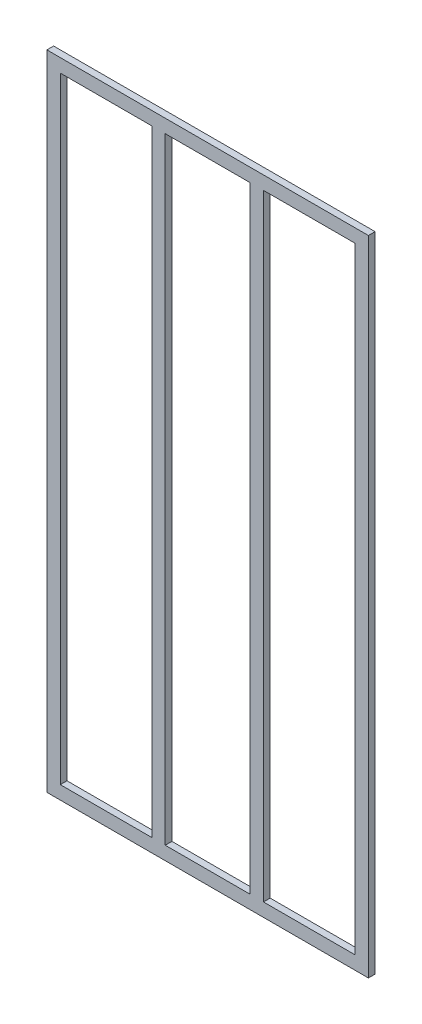
ISO-10303-21;
HEADER;
FILE_DESCRIPTION(('STEP AP214'),'2;1');
FILE_NAME('part.step','',(''),(''),'','','');
FILE_SCHEMA(('AUTOMOTIVE_DESIGN { 1 0 10303 214 1 1 1 1 }'));
ENDSEC;
DATA;
#1=APPLICATION_CONTEXT('core data for automotive mechanical design processes');
#2=APPLICATION_PROTOCOL_DEFINITION('international standard','automotive_design',2000,#1);
#3=PRODUCT_CONTEXT('',#1,'mechanical');
#4=PRODUCT('Part','Part','',(#3));
#5=PRODUCT_RELATED_PRODUCT_CATEGORY('part','',(#4));
#6=PRODUCT_DEFINITION_FORMATION('','',#4);
#7=PRODUCT_DEFINITION_CONTEXT('part definition',#1,'design');
#8=PRODUCT_DEFINITION('design','',#6,#7);
#9=PRODUCT_DEFINITION_SHAPE('','',#8);
#10=(LENGTH_UNIT() NAMED_UNIT(*) SI_UNIT(.MILLI.,.METRE.));
#11=(NAMED_UNIT(*) PLANE_ANGLE_UNIT() SI_UNIT($,.RADIAN.));
#12=(NAMED_UNIT(*) SI_UNIT($,.STERADIAN.) SOLID_ANGLE_UNIT());
#13=UNCERTAINTY_MEASURE_WITH_UNIT(LENGTH_MEASURE(1.E-05),#10,'distance_accuracy_value','');
#14=(GEOMETRIC_REPRESENTATION_CONTEXT(3) GLOBAL_UNCERTAINTY_ASSIGNED_CONTEXT((#13)) GLOBAL_UNIT_ASSIGNED_CONTEXT((#10,
#11,#12)) REPRESENTATION_CONTEXT('',''));
#15=CARTESIAN_POINT('',(0.,0.,0.));
#16=DIRECTION('',(0.,0.,1.));
#17=DIRECTION('',(1.,0.,0.));
#18=AXIS2_PLACEMENT_3D('',#15,#16,#17);
#19=CARTESIAN_POINT('',(-559.2,-1169.2,25.4));
#20=DIRECTION('',(0.,1.,0.));
#21=DIRECTION('',(0.,0.,1.));
#22=AXIS2_PLACEMENT_3D('',#19,#20,#21);
#23=PLANE('',#22);
#24=DIRECTION('',(0.,0.,1.));
#25=VECTOR('',#24,1.);
#26=CARTESIAN_POINT('',(161.,-1169.2,0.));
#27=LINE('',#26,#25);
#28=CARTESIAN_POINT('',(161.,-1169.2,0.));
#29=VERTEX_POINT('',#28);
#30=CARTESIAN_POINT('',(161.,-1169.2,25.4));
#31=VERTEX_POINT('',#30);
#32=EDGE_CURVE('E148',#29,#31,#27,.T.);
#33=ORIENTED_EDGE('',*,*,#32,.F.);
#34=DIRECTION('',(1.,0.,0.));
#35=VECTOR('',#34,1.);
#36=CARTESIAN_POINT('',(-559.2,-1169.2,0.));
#37=LINE('',#36,#35);
#38=CARTESIAN_POINT('',(-161.,-1169.2,0.));
#39=VERTEX_POINT('',#38);
#40=EDGE_CURVE('E158',#39,#29,#37,.T.);
#41=ORIENTED_EDGE('',*,*,#40,.F.);
#42=DIRECTION('',(0.,0.,1.));
#43=VECTOR('',#42,1.);
#44=CARTESIAN_POINT('',(-161.,-1169.2,0.));
#45=LINE('',#44,#43);
#46=CARTESIAN_POINT('',(-161.,-1169.2,25.4));
#47=VERTEX_POINT('',#46);
#48=EDGE_CURVE('E172',#39,#47,#45,.T.);
#49=ORIENTED_EDGE('',*,*,#48,.T.);
#50=DIRECTION('',(1.,0.,0.));
#51=VECTOR('',#50,1.);
#52=CARTESIAN_POINT('',(-559.2,-1169.2,25.4));
#53=LINE('',#52,#51);
#54=EDGE_CURVE('E160',#47,#31,#53,.T.);
#55=ORIENTED_EDGE('',*,*,#54,.T.);
#56=EDGE_LOOP('',(#33,#41,#49,#55));
#57=FACE_BOUND('',#56,.T.);
#58=ADVANCED_FACE('F35',(#57),#23,.T.);
#59=CARTESIAN_POINT('',(-559.2,1169.2,25.4));
#60=DIRECTION('',(0.,-1.,0.));
#61=DIRECTION('',(1.,0.,0.));
#62=AXIS2_PLACEMENT_3D('',#59,#60,#61);
#63=PLANE('',#62);
#64=DIRECTION('',(0.,0.,1.));
#65=VECTOR('',#64,1.);
#66=CARTESIAN_POINT('',(161.,1169.2,0.));
#67=LINE('',#66,#65);
#68=CARTESIAN_POINT('',(160.999999999999,1169.2,0.));
#69=VERTEX_POINT('',#68);
#70=CARTESIAN_POINT('',(161.,1169.2,25.4));
#71=VERTEX_POINT('',#70);
#72=EDGE_CURVE('E151',#69,#71,#67,.T.);
#73=ORIENTED_EDGE('',*,*,#72,.T.);
#74=DIRECTION('',(-1.,0.,0.));
#75=VECTOR('',#74,1.);
#76=CARTESIAN_POINT('',(-559.2,1169.2,25.4));
#77=LINE('',#76,#75);
#78=CARTESIAN_POINT('',(-161.,1169.2,25.4));
#79=VERTEX_POINT('',#78);
#80=EDGE_CURVE('E310',#71,#79,#77,.T.);
#81=ORIENTED_EDGE('',*,*,#80,.T.);
#82=DIRECTION('',(0.,0.,1.));
#83=VECTOR('',#82,1.);
#84=CARTESIAN_POINT('',(-161.,1169.2,0.));
#85=LINE('',#84,#83);
#86=CARTESIAN_POINT('',(-161.,1169.2,0.));
#87=VERTEX_POINT('',#86);
#88=EDGE_CURVE('E292',#87,#79,#85,.T.);
#89=ORIENTED_EDGE('',*,*,#88,.F.);
#90=DIRECTION('',(-1.,0.,0.));
#91=VECTOR('',#90,1.);
#92=CARTESIAN_POINT('',(-559.2,1169.2,0.));
#93=LINE('',#92,#91);
#94=EDGE_CURVE('E183',#69,#87,#93,.T.);
#95=ORIENTED_EDGE('',*,*,#94,.F.);
#96=EDGE_LOOP('',(#73,#81,#89,#95));
#97=FACE_BOUND('',#96,.T.);
#98=ADVANCED_FACE('F251',(#97),#63,.T.);
#99=DIRECTION('',(0.,0.,1.));
#100=VECTOR('',#99,1.);
#101=CARTESIAN_POINT('',(211.8,-1169.2,0.));
#102=LINE('',#101,#100);
#103=CARTESIAN_POINT('',(211.799999999999,-1169.2,0.));
#104=VERTEX_POINT('',#103);
#105=CARTESIAN_POINT('',(211.8,-1169.2,25.4));
#106=VERTEX_POINT('',#105);
#107=EDGE_CURVE('E161',#104,#106,#102,.T.);
#108=ORIENTED_EDGE('',*,*,#107,.T.);
#109=CARTESIAN_POINT('',(559.2,-1169.2,25.4));
#110=VERTEX_POINT('',#109);
#111=EDGE_CURVE('E186',#106,#110,#53,.T.);
#112=ORIENTED_EDGE('',*,*,#111,.T.);
#113=DIRECTION('',(0.,0.,-1.));
#114=VECTOR('',#113,1.);
#115=CARTESIAN_POINT('',(559.2,-1169.2,25.4));
#116=LINE('',#115,#114);
#117=CARTESIAN_POINT('',(559.2,-1169.2,0.));
#118=VERTEX_POINT('',#117);
#119=EDGE_CURVE('E195',#110,#118,#116,.T.);
#120=ORIENTED_EDGE('',*,*,#119,.T.);
#121=EDGE_CURVE('E168',#104,#118,#37,.T.);
#122=ORIENTED_EDGE('',*,*,#121,.F.);
#123=EDGE_LOOP('',(#108,#112,#120,#122));
#124=FACE_BOUND('',#123,.T.);
#125=ADVANCED_FACE('F253',(#124),#23,.T.);
#126=DIRECTION('',(0.,0.,1.));
#127=VECTOR('',#126,1.);
#128=CARTESIAN_POINT('',(211.8,1169.2,0.));
#129=LINE('',#128,#127);
#130=CARTESIAN_POINT('',(211.8,1169.2,0.));
#131=VERTEX_POINT('',#130);
#132=CARTESIAN_POINT('',(211.8,1169.2,25.4));
#133=VERTEX_POINT('',#132);
#134=EDGE_CURVE('E340',#131,#133,#129,.T.);
#135=ORIENTED_EDGE('',*,*,#134,.F.);
#136=CARTESIAN_POINT('',(559.2,1169.2,0.));
#137=VERTEX_POINT('',#136);
#138=EDGE_CURVE('E180',#137,#131,#93,.T.);
#139=ORIENTED_EDGE('',*,*,#138,.F.);
#140=DIRECTION('',(0.,0.,-1.));
#141=VECTOR('',#140,1.);
#142=CARTESIAN_POINT('',(559.2,1169.2,25.4));
#143=LINE('',#142,#141);
#144=CARTESIAN_POINT('',(559.2,1169.2,25.4));
#145=VERTEX_POINT('',#144);
#146=EDGE_CURVE('E193',#145,#137,#143,.T.);
#147=ORIENTED_EDGE('',*,*,#146,.F.);
#148=EDGE_CURVE('E308',#145,#133,#77,.T.);
#149=ORIENTED_EDGE('',*,*,#148,.T.);
#150=EDGE_LOOP('',(#135,#139,#147,#149));
#151=FACE_BOUND('',#150,.T.);
#152=ADVANCED_FACE('F260',(#151),#63,.T.);
#153=CARTESIAN_POINT('',(0.,0.,25.4));
#154=DIRECTION('',(0.,0.,-1.));
#155=DIRECTION('',(-1.,0.,0.));
#156=AXIS2_PLACEMENT_3D('',#153,#154,#155);
#157=PLANE('',#156);
#158=ORIENTED_EDGE('',*,*,#80,.F.);
#159=DIRECTION('',(0.,-1.,0.));
#160=VECTOR('',#159,1.);
#161=CARTESIAN_POINT('',(161.,-1169.2,25.4));
#162=LINE('',#161,#160);
#163=EDGE_CURVE('E334',#71,#31,#162,.T.);
#164=ORIENTED_EDGE('',*,*,#163,.T.);
#165=ORIENTED_EDGE('',*,*,#54,.F.);
#166=DIRECTION('',(0.,1.,0.));
#167=VECTOR('',#166,1.);
#168=CARTESIAN_POINT('',(-161.,-1169.2,25.4));
#169=LINE('',#168,#167);
#170=EDGE_CURVE('E299',#47,#79,#169,.T.);
#171=ORIENTED_EDGE('',*,*,#170,.T.);
#172=EDGE_LOOP('',(#158,#164,#165,#171));
#173=FACE_BOUND('',#172,.T.);
#174=DIRECTION('',(0.,1.,0.));
#175=VECTOR('',#174,1.);
#176=CARTESIAN_POINT('',(211.8,-1169.2,25.4));
#177=LINE('',#176,#175);
#178=EDGE_CURVE('E153',#106,#133,#177,.T.);
#179=ORIENTED_EDGE('',*,*,#178,.T.);
#180=ORIENTED_EDGE('',*,*,#148,.F.);
#181=DIRECTION('',(0.,1.,0.));
#182=VECTOR('',#181,1.);
#183=CARTESIAN_POINT('',(559.2,-1169.2,25.4));
#184=LINE('',#183,#182);
#185=EDGE_CURVE('E306',#110,#145,#184,.T.);
#186=ORIENTED_EDGE('',*,*,#185,.F.);
#187=ORIENTED_EDGE('',*,*,#111,.F.);
#188=EDGE_LOOP('',(#179,#180,#186,#187));
#189=FACE_BOUND('',#188,.T.);
#190=DIRECTION('',(0.,1.,0.));
#191=VECTOR('',#190,1.);
#192=CARTESIAN_POINT('',(610.,-1220.,25.4));
#193=LINE('',#192,#191);
#194=CARTESIAN_POINT('',(610.,-1220.,25.4));
#195=VERTEX_POINT('',#194);
#196=CARTESIAN_POINT('',(610.,1220.,25.4));
#197=VERTEX_POINT('',#196);
#198=EDGE_CURVE('E199',#195,#197,#193,.T.);
#199=ORIENTED_EDGE('',*,*,#198,.T.);
#200=DIRECTION('',(-1.,0.,0.));
#201=VECTOR('',#200,1.);
#202=CARTESIAN_POINT('',(-610.,1220.,25.4));
#203=LINE('',#202,#201);
#204=CARTESIAN_POINT('',(-610.,1220.,25.4));
#205=VERTEX_POINT('',#204);
#206=EDGE_CURVE('E202',#197,#205,#203,.T.);
#207=ORIENTED_EDGE('',*,*,#206,.T.);
#208=DIRECTION('',(0.,-1.,0.));
#209=VECTOR('',#208,1.);
#210=CARTESIAN_POINT('',(-610.,-1220.,25.4));
#211=LINE('',#210,#209);
#212=CARTESIAN_POINT('',(-610.,-1220.,25.4));
#213=VERTEX_POINT('',#212);
#214=EDGE_CURVE('E205',#205,#213,#211,.T.);
#215=ORIENTED_EDGE('',*,*,#214,.T.);
#216=DIRECTION('',(1.,0.,0.));
#217=VECTOR('',#216,1.);
#218=CARTESIAN_POINT('',(-610.,-1220.,25.4));
#219=LINE('',#218,#217);
#220=EDGE_CURVE('E207',#213,#195,#219,.T.);
#221=ORIENTED_EDGE('',*,*,#220,.T.);
#222=EDGE_LOOP('',(#199,#207,#215,#221));
#223=FACE_BOUND('',#222,.T.);
#224=CARTESIAN_POINT('',(-559.2,-1169.2,25.4));
#225=VERTEX_POINT('',#224);
#226=CARTESIAN_POINT('',(-211.8,-1169.2,25.4));
#227=VERTEX_POINT('',#226);
#228=EDGE_CURVE('E279',#225,#227,#53,.T.);
#229=ORIENTED_EDGE('',*,*,#228,.F.);
#230=DIRECTION('',(0.,-1.,0.));
#231=VECTOR('',#230,1.);
#232=CARTESIAN_POINT('',(-559.2,-1169.2,25.4));
#233=LINE('',#232,#231);
#234=CARTESIAN_POINT('',(-559.2,1169.2,25.4));
#235=VERTEX_POINT('',#234);
#236=EDGE_CURVE('E175',#235,#225,#233,.T.);
#237=ORIENTED_EDGE('',*,*,#236,.F.);
#238=CARTESIAN_POINT('',(-211.8,1169.2,25.4));
#239=VERTEX_POINT('',#238);
#240=EDGE_CURVE('E307',#239,#235,#77,.T.);
#241=ORIENTED_EDGE('',*,*,#240,.F.);
#242=DIRECTION('',(0.,-1.,0.));
#243=VECTOR('',#242,1.);
#244=CARTESIAN_POINT('',(-211.8,-1169.2,25.4));
#245=LINE('',#244,#243);
#246=EDGE_CURVE('E296',#239,#227,#245,.T.);
#247=ORIENTED_EDGE('',*,*,#246,.T.);
#248=EDGE_LOOP('',(#229,#237,#241,#247));
#249=FACE_BOUND('',#248,.T.);
#250=ADVANCED_FACE('F241',(#173,#189,#223,#249),#157,.F.);
#251=CARTESIAN_POINT('',(0.,0.,0.));
#252=DIRECTION('',(0.,0.,-1.));
#253=DIRECTION('',(-1.,0.,0.));
#254=AXIS2_PLACEMENT_3D('',#251,#252,#253);
#255=PLANE('',#254);
#256=DIRECTION('',(0.,-1.,0.));
#257=VECTOR('',#256,1.);
#258=CARTESIAN_POINT('',(161.,-1169.2,0.));
#259=LINE('',#258,#257);
#260=EDGE_CURVE('E50',#69,#29,#259,.T.);
#261=ORIENTED_EDGE('',*,*,#260,.F.);
#262=ORIENTED_EDGE('',*,*,#94,.T.);
#263=DIRECTION('',(0.,1.,0.));
#264=VECTOR('',#263,1.);
#265=CARTESIAN_POINT('',(-161.,-1169.2,0.));
#266=LINE('',#265,#264);
#267=EDGE_CURVE('E166',#39,#87,#266,.T.);
#268=ORIENTED_EDGE('',*,*,#267,.F.);
#269=ORIENTED_EDGE('',*,*,#40,.T.);
#270=EDGE_LOOP('',(#261,#262,#268,#269));
#271=FACE_BOUND('',#270,.T.);
#272=ORIENTED_EDGE('',*,*,#138,.T.);
#273=DIRECTION('',(0.,1.,0.));
#274=VECTOR('',#273,1.);
#275=CARTESIAN_POINT('',(211.8,-1169.2,0.));
#276=LINE('',#275,#274);
#277=EDGE_CURVE('E58',#104,#131,#276,.T.);
#278=ORIENTED_EDGE('',*,*,#277,.F.);
#279=ORIENTED_EDGE('',*,*,#121,.T.);
#280=DIRECTION('',(0.,1.,0.));
#281=VECTOR('',#280,1.);
#282=CARTESIAN_POINT('',(559.2,-1169.2,0.));
#283=LINE('',#282,#281);
#284=EDGE_CURVE('E171',#118,#137,#283,.T.);
#285=ORIENTED_EDGE('',*,*,#284,.T.);
#286=EDGE_LOOP('',(#272,#278,#279,#285));
#287=FACE_BOUND('',#286,.T.);
#288=DIRECTION('',(0.,1.,0.));
#289=VECTOR('',#288,1.);
#290=CARTESIAN_POINT('',(610.,-1220.,0.));
#291=LINE('',#290,#289);
#292=CARTESIAN_POINT('',(610.,-1220.,0.));
#293=VERTEX_POINT('',#292);
#294=CARTESIAN_POINT('',(610.,1220.,0.));
#295=VERTEX_POINT('',#294);
#296=EDGE_CURVE('E198',#293,#295,#291,.T.);
#297=ORIENTED_EDGE('',*,*,#296,.F.);
#298=DIRECTION('',(1.,0.,0.));
#299=VECTOR('',#298,1.);
#300=CARTESIAN_POINT('',(-610.,-1220.,0.));
#301=LINE('',#300,#299);
#302=CARTESIAN_POINT('',(-610.,-1220.,0.));
#303=VERTEX_POINT('',#302);
#304=EDGE_CURVE('E203',#303,#293,#301,.T.);
#305=ORIENTED_EDGE('',*,*,#304,.F.);
#306=DIRECTION('',(0.,-1.,0.));
#307=VECTOR('',#306,1.);
#308=CARTESIAN_POINT('',(-610.,-1220.,0.));
#309=LINE('',#308,#307);
#310=CARTESIAN_POINT('',(-610.,1220.,0.));
#311=VERTEX_POINT('',#310);
#312=EDGE_CURVE('E214',#311,#303,#309,.T.);
#313=ORIENTED_EDGE('',*,*,#312,.F.);
#314=DIRECTION('',(-1.,0.,0.));
#315=VECTOR('',#314,1.);
#316=CARTESIAN_POINT('',(-610.,1220.,0.));
#317=LINE('',#316,#315);
#318=EDGE_CURVE('E212',#295,#311,#317,.T.);
#319=ORIENTED_EDGE('',*,*,#318,.F.);
#320=EDGE_LOOP('',(#297,#305,#313,#319));
#321=FACE_BOUND('',#320,.T.);
#322=DIRECTION('',(0.,-1.,0.));
#323=VECTOR('',#322,1.);
#324=CARTESIAN_POINT('',(-559.2,-1169.2,0.));
#325=LINE('',#324,#323);
#326=CARTESIAN_POINT('',(-559.2,1169.2,0.));
#327=VERTEX_POINT('',#326);
#328=CARTESIAN_POINT('',(-559.2,-1169.2,0.));
#329=VERTEX_POINT('',#328);
#330=EDGE_CURVE('E182',#327,#329,#325,.T.);
#331=ORIENTED_EDGE('',*,*,#330,.T.);
#332=CARTESIAN_POINT('',(-211.8,-1169.2,0.));
#333=VERTEX_POINT('',#332);
#334=EDGE_CURVE('E167',#329,#333,#37,.T.);
#335=ORIENTED_EDGE('',*,*,#334,.T.);
#336=DIRECTION('',(0.,-1.,0.));
#337=VECTOR('',#336,1.);
#338=CARTESIAN_POINT('',(-211.8,-1169.2,0.));
#339=LINE('',#338,#337);
#340=CARTESIAN_POINT('',(-211.8,1169.2,0.));
#341=VERTEX_POINT('',#340);
#342=EDGE_CURVE('E287',#341,#333,#339,.T.);
#343=ORIENTED_EDGE('',*,*,#342,.F.);
#344=EDGE_CURVE('E179',#341,#327,#93,.T.);
#345=ORIENTED_EDGE('',*,*,#344,.T.);
#346=EDGE_LOOP('',(#331,#335,#343,#345));
#347=FACE_BOUND('',#346,.T.);
#348=ADVANCED_FACE('F164',(#271,#287,#321,#347),#255,.T.);
#349=CARTESIAN_POINT('',(610.,-1220.,25.4));
#350=DIRECTION('',(-1.,0.,0.));
#351=DIRECTION('',(0.,0.,1.));
#352=AXIS2_PLACEMENT_3D('',#349,#350,#351);
#353=PLANE('',#352);
#354=ORIENTED_EDGE('',*,*,#296,.T.);
#355=DIRECTION('',(0.,0.,-1.));
#356=VECTOR('',#355,1.);
#357=CARTESIAN_POINT('',(610.,1220.,25.4));
#358=LINE('',#357,#356);
#359=EDGE_CURVE('E11',#197,#295,#358,.T.);
#360=ORIENTED_EDGE('',*,*,#359,.F.);
#361=ORIENTED_EDGE('',*,*,#198,.F.);
#362=DIRECTION('',(0.,0.,-1.));
#363=VECTOR('',#362,1.);
#364=CARTESIAN_POINT('',(610.,-1220.,25.4));
#365=LINE('',#364,#363);
#366=EDGE_CURVE('E209',#195,#293,#365,.T.);
#367=ORIENTED_EDGE('',*,*,#366,.T.);
#368=EDGE_LOOP('',(#354,#360,#361,#367));
#369=FACE_BOUND('',#368,.T.);
#370=ADVANCED_FACE('F37',(#369),#353,.F.);
#371=CARTESIAN_POINT('',(-610.,1220.,25.4));
#372=DIRECTION('',(0.,-1.,0.));
#373=DIRECTION('',(0.,0.,-1.));
#374=AXIS2_PLACEMENT_3D('',#371,#372,#373);
#375=PLANE('',#374);
#376=ORIENTED_EDGE('',*,*,#318,.T.);
#377=DIRECTION('',(0.,0.,-1.));
#378=VECTOR('',#377,1.);
#379=CARTESIAN_POINT('',(-610.,1220.,25.4));
#380=LINE('',#379,#378);
#381=EDGE_CURVE('E43',#205,#311,#380,.T.);
#382=ORIENTED_EDGE('',*,*,#381,.F.);
#383=ORIENTED_EDGE('',*,*,#206,.F.);
#384=ORIENTED_EDGE('',*,*,#359,.T.);
#385=EDGE_LOOP('',(#376,#382,#383,#384));
#386=FACE_BOUND('',#385,.T.);
#387=ADVANCED_FACE('F243',(#386),#375,.F.);
#388=CARTESIAN_POINT('',(-610.,-1220.,25.4));
#389=DIRECTION('',(1.,0.,0.));
#390=DIRECTION('',(0.,0.,-1.));
#391=AXIS2_PLACEMENT_3D('',#388,#389,#390);
#392=PLANE('',#391);
#393=ORIENTED_EDGE('',*,*,#312,.T.);
#394=DIRECTION('',(0.,0.,-1.));
#395=VECTOR('',#394,1.);
#396=CARTESIAN_POINT('',(-610.,-1220.,25.4));
#397=LINE('',#396,#395);
#398=EDGE_CURVE('E219',#213,#303,#397,.T.);
#399=ORIENTED_EDGE('',*,*,#398,.F.);
#400=ORIENTED_EDGE('',*,*,#214,.F.);
#401=ORIENTED_EDGE('',*,*,#381,.T.);
#402=EDGE_LOOP('',(#393,#399,#400,#401));
#403=FACE_BOUND('',#402,.T.);
#404=ADVANCED_FACE('F226',(#403),#392,.F.);
#405=CARTESIAN_POINT('',(-610.,-1220.,25.4));
#406=DIRECTION('',(0.,1.,0.));
#407=DIRECTION('',(0.,0.,1.));
#408=AXIS2_PLACEMENT_3D('',#405,#406,#407);
#409=PLANE('',#408);
#410=ORIENTED_EDGE('',*,*,#304,.T.);
#411=ORIENTED_EDGE('',*,*,#366,.F.);
#412=ORIENTED_EDGE('',*,*,#220,.F.);
#413=ORIENTED_EDGE('',*,*,#398,.T.);
#414=EDGE_LOOP('',(#410,#411,#412,#413));
#415=FACE_BOUND('',#414,.T.);
#416=ADVANCED_FACE('F235',(#415),#409,.F.);
#417=DIRECTION('',(0.,0.,1.));
#418=VECTOR('',#417,1.);
#419=CARTESIAN_POINT('',(-211.8,-1169.2,0.));
#420=LINE('',#419,#418);
#421=EDGE_CURVE('E276',#333,#227,#420,.T.);
#422=ORIENTED_EDGE('',*,*,#421,.F.);
#423=ORIENTED_EDGE('',*,*,#334,.F.);
#424=DIRECTION('',(0.,0.,-1.));
#425=VECTOR('',#424,1.);
#426=CARTESIAN_POINT('',(-559.2,-1169.2,25.4));
#427=LINE('',#426,#425);
#428=EDGE_CURVE('E187',#225,#329,#427,.T.);
#429=ORIENTED_EDGE('',*,*,#428,.F.);
#430=ORIENTED_EDGE('',*,*,#228,.T.);
#431=EDGE_LOOP('',(#422,#423,#429,#430));
#432=FACE_BOUND('',#431,.T.);
#433=ADVANCED_FACE('F254',(#432),#23,.T.);
#434=CARTESIAN_POINT('',(559.2,-1169.2,25.4));
#435=DIRECTION('',(-1.,0.,0.));
#436=DIRECTION('',(0.,0.,1.));
#437=AXIS2_PLACEMENT_3D('',#434,#435,#436);
#438=PLANE('',#437);
#439=ORIENTED_EDGE('',*,*,#284,.F.);
#440=ORIENTED_EDGE('',*,*,#119,.F.);
#441=ORIENTED_EDGE('',*,*,#185,.T.);
#442=ORIENTED_EDGE('',*,*,#146,.T.);
#443=EDGE_LOOP('',(#439,#440,#441,#442));
#444=FACE_BOUND('',#443,.T.);
#445=ADVANCED_FACE('F267',(#444),#438,.T.);
#446=DIRECTION('',(0.,0.,1.));
#447=VECTOR('',#446,1.);
#448=CARTESIAN_POINT('',(-211.8,1169.2,0.));
#449=LINE('',#448,#447);
#450=EDGE_CURVE('E284',#341,#239,#449,.T.);
#451=ORIENTED_EDGE('',*,*,#450,.T.);
#452=ORIENTED_EDGE('',*,*,#240,.T.);
#453=DIRECTION('',(0.,0.,-1.));
#454=VECTOR('',#453,1.);
#455=CARTESIAN_POINT('',(-559.2,1169.2,25.4));
#456=LINE('',#455,#454);
#457=EDGE_CURVE('E190',#235,#327,#456,.T.);
#458=ORIENTED_EDGE('',*,*,#457,.T.);
#459=ORIENTED_EDGE('',*,*,#344,.F.);
#460=EDGE_LOOP('',(#451,#452,#458,#459));
#461=FACE_BOUND('',#460,.T.);
#462=ADVANCED_FACE('F261',(#461),#63,.T.);
#463=CARTESIAN_POINT('',(-559.2,-1169.2,25.4));
#464=DIRECTION('',(1.,0.,0.));
#465=DIRECTION('',(0.,0.,-1.));
#466=AXIS2_PLACEMENT_3D('',#463,#464,#465);
#467=PLANE('',#466);
#468=ORIENTED_EDGE('',*,*,#330,.F.);
#469=ORIENTED_EDGE('',*,*,#457,.F.);
#470=ORIENTED_EDGE('',*,*,#236,.T.);
#471=ORIENTED_EDGE('',*,*,#428,.T.);
#472=EDGE_LOOP('',(#468,#469,#470,#471));
#473=FACE_BOUND('',#472,.T.);
#474=ADVANCED_FACE('F319',(#473),#467,.T.);
#475=CARTESIAN_POINT('',(-161.,-1169.2,0.));
#476=DIRECTION('',(1.,0.,0.));
#477=DIRECTION('',(0.,0.,-1.));
#478=AXIS2_PLACEMENT_3D('',#475,#476,#477);
#479=PLANE('',#478);
#480=ORIENTED_EDGE('',*,*,#170,.F.);
#481=ORIENTED_EDGE('',*,*,#48,.F.);
#482=ORIENTED_EDGE('',*,*,#267,.T.);
#483=ORIENTED_EDGE('',*,*,#88,.T.);
#484=EDGE_LOOP('',(#480,#481,#482,#483));
#485=FACE_BOUND('',#484,.T.);
#486=ADVANCED_FACE('F356',(#485),#479,.T.);
#487=CARTESIAN_POINT('',(-211.8,-1169.2,0.));
#488=DIRECTION('',(-1.,0.,0.));
#489=DIRECTION('',(0.,0.,1.));
#490=AXIS2_PLACEMENT_3D('',#487,#488,#489);
#491=PLANE('',#490);
#492=ORIENTED_EDGE('',*,*,#246,.F.);
#493=ORIENTED_EDGE('',*,*,#450,.F.);
#494=ORIENTED_EDGE('',*,*,#342,.T.);
#495=ORIENTED_EDGE('',*,*,#421,.T.);
#496=EDGE_LOOP('',(#492,#493,#494,#495));
#497=FACE_BOUND('',#496,.T.);
#498=ADVANCED_FACE('F290',(#497),#491,.T.);
#499=CARTESIAN_POINT('',(161.,-1169.2,0.));
#500=DIRECTION('',(-1.,0.,0.));
#501=DIRECTION('',(0.,0.,1.));
#502=AXIS2_PLACEMENT_3D('',#499,#500,#501);
#503=PLANE('',#502);
#504=ORIENTED_EDGE('',*,*,#163,.F.);
#505=ORIENTED_EDGE('',*,*,#72,.F.);
#506=ORIENTED_EDGE('',*,*,#260,.T.);
#507=ORIENTED_EDGE('',*,*,#32,.T.);
#508=EDGE_LOOP('',(#504,#505,#506,#507));
#509=FACE_BOUND('',#508,.T.);
#510=ADVANCED_FACE('F147',(#509),#503,.T.);
#511=CARTESIAN_POINT('',(211.8,-1169.2,0.));
#512=DIRECTION('',(1.,0.,0.));
#513=DIRECTION('',(0.,0.,-1.));
#514=AXIS2_PLACEMENT_3D('',#511,#512,#513);
#515=PLANE('',#514);
#516=ORIENTED_EDGE('',*,*,#178,.F.);
#517=ORIENTED_EDGE('',*,*,#107,.F.);
#518=ORIENTED_EDGE('',*,*,#277,.T.);
#519=ORIENTED_EDGE('',*,*,#134,.T.);
#520=EDGE_LOOP('',(#516,#517,#518,#519));
#521=FACE_BOUND('',#520,.T.);
#522=ADVANCED_FACE('F344',(#521),#515,.T.);
#523=CLOSED_SHELL('',(#58,#98,#125,#152,#250,#348,#370,#387,#404,#416,#433,#445,#462,#474,#486,
#498,#510,#522));
#524=MANIFOLD_SOLID_BREP('B2',#523);
#525=ADVANCED_BREP_SHAPE_REPRESENTATION('',(#18,#524),#14);
#526=SHAPE_DEFINITION_REPRESENTATION(#9,#525);
ENDSEC;
END-ISO-10303-21;
